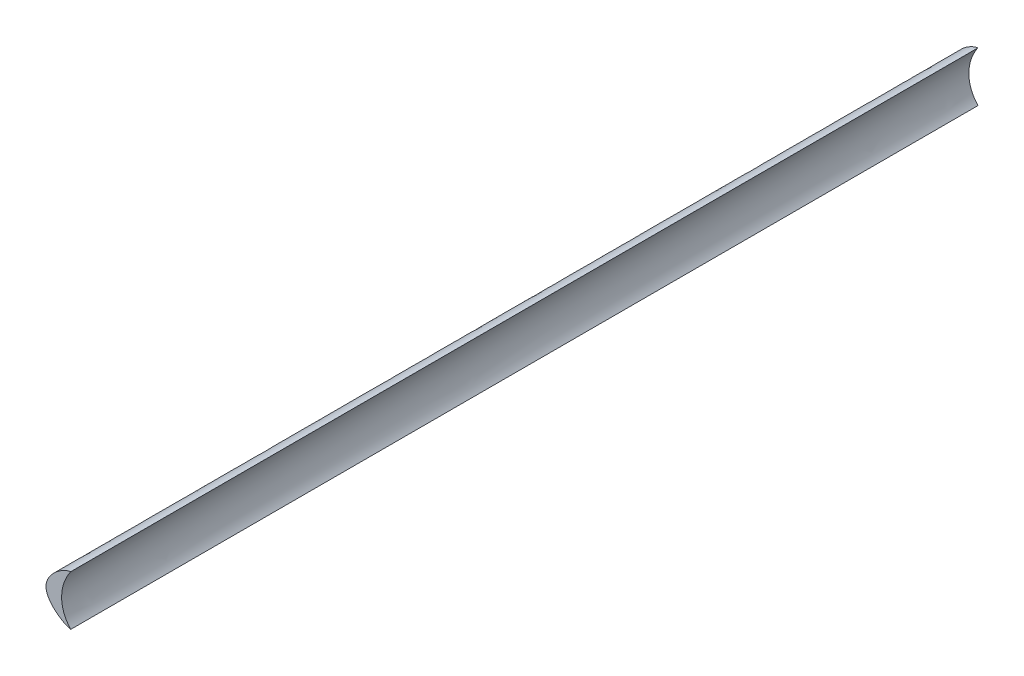
ISO-10303-21;
HEADER;
FILE_DESCRIPTION(('STEP AP214'),'2;1');
FILE_NAME('part.step','',(''),(''),'','','');
FILE_SCHEMA(('AUTOMOTIVE_DESIGN { 1 0 10303 214 1 1 1 1 }'));
ENDSEC;
DATA;
#1=APPLICATION_CONTEXT('core data for automotive mechanical design processes');
#2=APPLICATION_PROTOCOL_DEFINITION('international standard','automotive_design',2000,#1);
#3=PRODUCT_CONTEXT('',#1,'mechanical');
#4=PRODUCT('Part','Part','',(#3));
#5=PRODUCT_RELATED_PRODUCT_CATEGORY('part','',(#4));
#6=PRODUCT_DEFINITION_FORMATION('','',#4);
#7=PRODUCT_DEFINITION_CONTEXT('part definition',#1,'design');
#8=PRODUCT_DEFINITION('design','',#6,#7);
#9=PRODUCT_DEFINITION_SHAPE('','',#8);
#10=(LENGTH_UNIT() NAMED_UNIT(*) SI_UNIT(.MILLI.,.METRE.));
#11=(NAMED_UNIT(*) PLANE_ANGLE_UNIT() SI_UNIT($,.RADIAN.));
#12=(NAMED_UNIT(*) SI_UNIT($,.STERADIAN.) SOLID_ANGLE_UNIT());
#13=UNCERTAINTY_MEASURE_WITH_UNIT(LENGTH_MEASURE(1.E-05),#10,'distance_accuracy_value','');
#14=(GEOMETRIC_REPRESENTATION_CONTEXT(3) GLOBAL_UNCERTAINTY_ASSIGNED_CONTEXT((#13)) GLOBAL_UNIT_ASSIGNED_CONTEXT((#10,
#11,#12)) REPRESENTATION_CONTEXT('',''));
#15=CARTESIAN_POINT('',(0.,0.,0.));
#16=DIRECTION('',(0.,0.,1.));
#17=DIRECTION('',(1.,0.,0.));
#18=AXIS2_PLACEMENT_3D('',#15,#16,#17);
#19=CARTESIAN_POINT('',(1.23382463388359,18.7944994668809,-350.));
#20=CARTESIAN_POINT('',(-6.38021491638542,17.5523450588483,-350.));
#21=CARTESIAN_POINT('',(-29.9338082785648,-1.20321685887418,-350.));
#22=CARTESIAN_POINT('',(-5.33411333084054,-18.6232666356244,-350.));
#23=CARTESIAN_POINT('',(1.23382463388359,-19.7751807407846,-350.));
#24=B_SPLINE_CURVE_WITH_KNOTS('',3,(#19,#20,#21,#22,#23),.UNSPECIFIED.,.F.,.F.,(4,1,4),(0.,
0.514535378138311,1.),.UNSPECIFIED.);
#25=DIRECTION('',(0.,0.,1.));
#26=VECTOR('',#25,1.);
#27=SURFACE_OF_LINEAR_EXTRUSION('',#24,#26);
#28=DIRECTION('',(0.,0.,1.));
#29=VECTOR('',#28,1.);
#30=CARTESIAN_POINT('',(1.23382463388359,-19.7751807407846,-350.));
#31=LINE('',#30,#29);
#32=CARTESIAN_POINT('',(1.23382463388359,-19.7751807407846,-350.));
#33=VERTEX_POINT('',#32);
#34=CARTESIAN_POINT('',(1.23382463388359,-19.7751807407846,350.));
#35=VERTEX_POINT('',#34);
#36=EDGE_CURVE('E38',#33,#35,#31,.T.);
#37=ORIENTED_EDGE('',*,*,#36,.T.);
#38=CARTESIAN_POINT('',(1.23382463388359,18.7944994668809,350.));
#39=CARTESIAN_POINT('',(-6.38021491638542,17.5523450588483,350.));
#40=CARTESIAN_POINT('',(-29.9338082785648,-1.20321685887418,350.));
#41=CARTESIAN_POINT('',(-5.33411333084054,-18.6232666356244,350.));
#42=CARTESIAN_POINT('',(1.23382463388359,-19.7751807407846,350.));
#43=B_SPLINE_CURVE_WITH_KNOTS('',3,(#38,#39,#40,#41,#42),.UNSPECIFIED.,.F.,.F.,(4,1,4),(0.,
0.514535378138311,1.),.UNSPECIFIED.);
#44=CARTESIAN_POINT('',(1.23382463388359,18.7944994668809,350.));
#45=VERTEX_POINT('',#44);
#46=EDGE_CURVE('E59',#45,#35,#43,.T.);
#47=ORIENTED_EDGE('',*,*,#46,.F.);
#48=DIRECTION('',(0.,0.,1.));
#49=VECTOR('',#48,1.);
#50=CARTESIAN_POINT('',(1.23382463388359,18.7944994668809,-350.));
#51=LINE('',#50,#49);
#52=CARTESIAN_POINT('',(1.23382463388359,18.7944994668809,-350.));
#53=VERTEX_POINT('',#52);
#54=EDGE_CURVE('E11',#53,#45,#51,.T.);
#55=ORIENTED_EDGE('',*,*,#54,.F.);
#56=EDGE_CURVE('E60',#53,#33,#24,.T.);
#57=ORIENTED_EDGE('',*,*,#56,.T.);
#58=EDGE_LOOP('',(#37,#47,#55,#57));
#59=FACE_BOUND('',#58,.T.);
#60=ADVANCED_FACE('F34',(#59),#27,.T.);
#61=CARTESIAN_POINT('',(1.23382463388359,-19.7751807407846,-350.));
#62=CARTESIAN_POINT('',(-9.36316198961851,-8.53455075133448,-350.));
#63=CARTESIAN_POINT('',(-6.88060643971659,7.6315831643084,-350.));
#64=CARTESIAN_POINT('',(1.23382463388359,18.7944994668809,-350.));
#65=B_SPLINE_CURVE_WITH_KNOTS('',3,(#61,#62,#63,#64),.UNSPECIFIED.,.F.,.F.,(4,4),(0.,1.),.UNSPECIFIED.);
#66=DIRECTION('',(0.,0.,1.));
#67=VECTOR('',#66,1.);
#68=SURFACE_OF_LINEAR_EXTRUSION('',#65,#67);
#69=ORIENTED_EDGE('',*,*,#54,.T.);
#70=CARTESIAN_POINT('',(1.23382463388359,-19.7751807407846,350.));
#71=CARTESIAN_POINT('',(-9.36316198961851,-8.53455075133448,350.));
#72=CARTESIAN_POINT('',(-6.88060643971659,7.6315831643084,350.));
#73=CARTESIAN_POINT('',(1.23382463388359,18.7944994668809,350.));
#74=B_SPLINE_CURVE_WITH_KNOTS('',3,(#70,#71,#72,#73),.UNSPECIFIED.,.F.,.F.,(4,4),(0.,1.),.UNSPECIFIED.);
#75=EDGE_CURVE('E64',#35,#45,#74,.T.);
#76=ORIENTED_EDGE('',*,*,#75,.F.);
#77=ORIENTED_EDGE('',*,*,#36,.F.);
#78=EDGE_CURVE('E62',#33,#53,#65,.T.);
#79=ORIENTED_EDGE('',*,*,#78,.T.);
#80=EDGE_LOOP('',(#69,#76,#77,#79));
#81=FACE_BOUND('',#80,.T.);
#82=ADVANCED_FACE('F65',(#81),#68,.T.);
#83=CARTESIAN_POINT('',(-17.893304215233,-0.606341090135373,-350.));
#84=DIRECTION('',(0.,0.,-1.));
#85=DIRECTION('',(-1.,0.,0.));
#86=AXIS2_PLACEMENT_3D('',#83,#84,#85);
#87=PLANE('',#86);
#88=ORIENTED_EDGE('',*,*,#56,.F.);
#89=ORIENTED_EDGE('',*,*,#78,.F.);
#90=EDGE_LOOP('',(#88,#89));
#91=FACE_BOUND('',#90,.T.);
#92=ADVANCED_FACE('F95',(#91),#87,.T.);
#93=CARTESIAN_POINT('',(-17.893304215233,-0.606341090135373,350.));
#94=DIRECTION('',(0.,0.,-1.));
#95=DIRECTION('',(-1.,0.,0.));
#96=AXIS2_PLACEMENT_3D('',#93,#94,#95);
#97=PLANE('',#96);
#98=ORIENTED_EDGE('',*,*,#46,.T.);
#99=ORIENTED_EDGE('',*,*,#75,.T.);
#100=EDGE_LOOP('',(#98,#99));
#101=FACE_BOUND('',#100,.T.);
#102=ADVANCED_FACE('F68',(#101),#97,.F.);
#103=CLOSED_SHELL('',(#60,#82,#92,#102));
#104=MANIFOLD_SOLID_BREP('B2',#103);
#105=ADVANCED_BREP_SHAPE_REPRESENTATION('',(#18,#104),#14);
#106=SHAPE_DEFINITION_REPRESENTATION(#9,#105);
ENDSEC;
END-ISO-10303-21;
